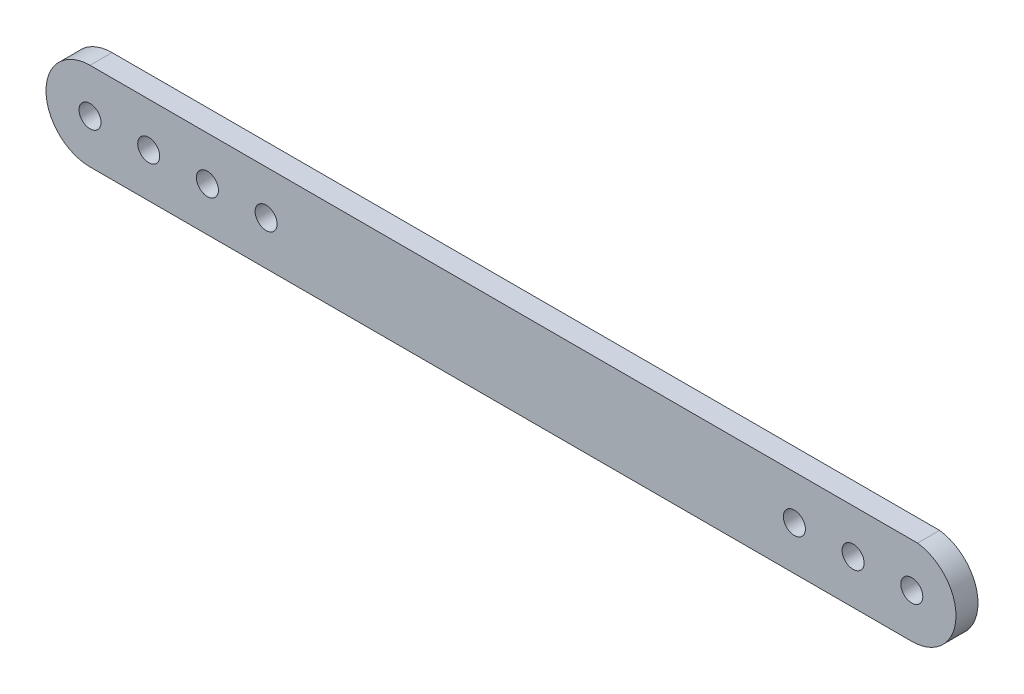
ISO-10303-21;
HEADER;
FILE_DESCRIPTION(('STEP AP214'),'2;1');
FILE_NAME('part.step','',(''),(''),'','','');
FILE_SCHEMA(('AUTOMOTIVE_DESIGN { 1 0 10303 214 1 1 1 1 }'));
ENDSEC;
DATA;
#1=APPLICATION_CONTEXT('core data for automotive mechanical design processes');
#2=APPLICATION_PROTOCOL_DEFINITION('international standard','automotive_design',2000,#1);
#3=PRODUCT_CONTEXT('',#1,'mechanical');
#4=PRODUCT('Part','Part','',(#3));
#5=PRODUCT_RELATED_PRODUCT_CATEGORY('part','',(#4));
#6=PRODUCT_DEFINITION_FORMATION('','',#4);
#7=PRODUCT_DEFINITION_CONTEXT('part definition',#1,'design');
#8=PRODUCT_DEFINITION('design','',#6,#7);
#9=PRODUCT_DEFINITION_SHAPE('','',#8);
#10=(LENGTH_UNIT() NAMED_UNIT(*) SI_UNIT(.MILLI.,.METRE.));
#11=(NAMED_UNIT(*) PLANE_ANGLE_UNIT() SI_UNIT($,.RADIAN.));
#12=(NAMED_UNIT(*) SI_UNIT($,.STERADIAN.) SOLID_ANGLE_UNIT());
#13=UNCERTAINTY_MEASURE_WITH_UNIT(LENGTH_MEASURE(1.E-05),#10,'distance_accuracy_value','');
#14=(GEOMETRIC_REPRESENTATION_CONTEXT(3) GLOBAL_UNCERTAINTY_ASSIGNED_CONTEXT((#13)) GLOBAL_UNIT_ASSIGNED_CONTEXT((#10,
#11,#12)) REPRESENTATION_CONTEXT('',''));
#15=CARTESIAN_POINT('',(0.,0.,0.));
#16=DIRECTION('',(0.,0.,1.));
#17=DIRECTION('',(1.,0.,0.));
#18=AXIS2_PLACEMENT_3D('',#15,#16,#17);
#19=CARTESIAN_POINT('',(0.,0.,4.7625));
#20=DIRECTION('',(0.,0.,1.));
#21=DIRECTION('',(1.,0.,0.));
#22=AXIS2_PLACEMENT_3D('',#19,#20,#21);
#23=PLANE('',#22);
#24=CARTESIAN_POINT('',(165.1,2.21750824338182E-07,4.7625));
#25=DIRECTION('',(0.,0.,1.));
#26=DIRECTION('',(1.,0.,0.));
#27=AXIS2_PLACEMENT_3D('',#24,#25,#26);
#28=CIRCLE('',#27,2.38125000000001);
#29=CARTESIAN_POINT('',(162.71875,2.21750824338182E-07,4.7625));
#30=VERTEX_POINT('',#29);
#31=EDGE_CURVE('E139',#30,#30,#28,.T.);
#32=ORIENTED_EDGE('',*,*,#31,.F.);
#33=EDGE_LOOP('',(#32));
#34=FACE_BOUND('',#33,.T.);
#35=CARTESIAN_POINT('',(38.1,0.,4.7625));
#36=DIRECTION('',(0.,0.,1.));
#37=DIRECTION('',(1.,0.,0.));
#38=AXIS2_PLACEMENT_3D('',#35,#36,#37);
#39=CIRCLE('',#38,2.38125);
#40=CARTESIAN_POINT('',(35.71875,0.,4.7625));
#41=VERTEX_POINT('',#40);
#42=EDGE_CURVE('E127',#41,#41,#39,.T.);
#43=ORIENTED_EDGE('',*,*,#42,.F.);
#44=EDGE_LOOP('',(#43));
#45=FACE_BOUND('',#44,.T.);
#46=CARTESIAN_POINT('',(12.7,0.,4.7625));
#47=DIRECTION('',(0.,0.,1.));
#48=DIRECTION('',(1.,0.,0.));
#49=AXIS2_PLACEMENT_3D('',#46,#47,#48);
#50=CIRCLE('',#49,2.38125);
#51=CARTESIAN_POINT('',(10.31875,0.,4.7625));
#52=VERTEX_POINT('',#51);
#53=EDGE_CURVE('E115',#52,#52,#50,.T.);
#54=ORIENTED_EDGE('',*,*,#53,.F.);
#55=EDGE_LOOP('',(#54));
#56=FACE_BOUND('',#55,.T.);
#57=CARTESIAN_POINT('',(0.,0.,4.7625));
#58=DIRECTION('',(0.,0.,1.));
#59=DIRECTION('',(1.,0.,0.));
#60=AXIS2_PLACEMENT_3D('',#57,#58,#59);
#61=CIRCLE('',#60,9.525);
#62=CARTESIAN_POINT('',(0.,9.525,4.7625));
#63=VERTEX_POINT('',#62);
#64=CARTESIAN_POINT('',(0.,-9.525,4.7625));
#65=VERTEX_POINT('',#64);
#66=EDGE_CURVE('E85',#63,#65,#61,.T.);
#67=ORIENTED_EDGE('',*,*,#66,.T.);
#68=DIRECTION('',(1.,0.,0.));
#69=VECTOR('',#68,1.);
#70=CARTESIAN_POINT('',(0.,-9.525,4.7625));
#71=LINE('',#70,#69);
#72=CARTESIAN_POINT('',(177.799932549432,-9.525,4.7625));
#73=VERTEX_POINT('',#72);
#74=EDGE_CURVE('E80',#65,#73,#71,.T.);
#75=ORIENTED_EDGE('',*,*,#74,.T.);
#76=CARTESIAN_POINT('',(177.799932549432,0.0413915238402598,4.7625));
#77=DIRECTION('',(0.,0.,1.));
#78=DIRECTION('',(1.,0.,0.));
#79=AXIS2_PLACEMENT_3D('',#76,#77,#78);
#80=CIRCLE('',#79,9.56639152384026);
#81=CARTESIAN_POINT('',(179.055725947373,9.525,4.7625));
#82=VERTEX_POINT('',#81);
#83=EDGE_CURVE('E83',#73,#82,#80,.T.);
#84=ORIENTED_EDGE('',*,*,#83,.T.);
#85=DIRECTION('',(-1.,0.,0.));
#86=VECTOR('',#85,1.);
#87=CARTESIAN_POINT('',(0.,9.525,4.7625));
#88=LINE('',#87,#86);
#89=EDGE_CURVE('E50',#82,#63,#88,.T.);
#90=ORIENTED_EDGE('',*,*,#89,.T.);
#91=EDGE_LOOP('',(#67,#75,#84,#90));
#92=FACE_BOUND('',#91,.T.);
#93=CARTESIAN_POINT('',(0.,0.,4.7625));
#94=DIRECTION('',(0.,0.,1.));
#95=DIRECTION('',(1.,0.,0.));
#96=AXIS2_PLACEMENT_3D('',#93,#94,#95);
#97=CIRCLE('',#96,2.38125);
#98=CARTESIAN_POINT('',(-2.38125,0.,4.7625));
#99=VERTEX_POINT('',#98);
#100=EDGE_CURVE('E100',#99,#99,#97,.T.);
#101=ORIENTED_EDGE('',*,*,#100,.F.);
#102=EDGE_LOOP('',(#101));
#103=FACE_BOUND('',#102,.T.);
#104=CARTESIAN_POINT('',(25.4,0.,4.7625));
#105=DIRECTION('',(0.,0.,1.));
#106=DIRECTION('',(1.,0.,0.));
#107=AXIS2_PLACEMENT_3D('',#104,#105,#106);
#108=CIRCLE('',#107,2.38125);
#109=CARTESIAN_POINT('',(23.01875,0.,4.7625));
#110=VERTEX_POINT('',#109);
#111=EDGE_CURVE('E121',#110,#110,#108,.T.);
#112=ORIENTED_EDGE('',*,*,#111,.F.);
#113=EDGE_LOOP('',(#112));
#114=FACE_BOUND('',#113,.T.);
#115=CARTESIAN_POINT('',(177.799932549432,0.0413915238402598,4.7625));
#116=DIRECTION('',(0.,0.,1.));
#117=DIRECTION('',(1.,0.,0.));
#118=AXIS2_PLACEMENT_3D('',#115,#116,#117);
#119=CIRCLE('',#118,2.38125000000001);
#120=CARTESIAN_POINT('',(175.418682549432,0.0413915238402598,4.7625));
#121=VERTEX_POINT('',#120);
#122=EDGE_CURVE('E133',#121,#121,#119,.T.);
#123=ORIENTED_EDGE('',*,*,#122,.F.);
#124=EDGE_LOOP('',(#123));
#125=FACE_BOUND('',#124,.T.);
#126=CARTESIAN_POINT('',(152.4,2.6927270091158E-08,4.7625));
#127=DIRECTION('',(0.,0.,1.));
#128=DIRECTION('',(1.,0.,0.));
#129=AXIS2_PLACEMENT_3D('',#126,#127,#128);
#130=CIRCLE('',#129,2.38125000000001);
#131=CARTESIAN_POINT('',(150.01875,2.6927270091158E-08,4.7625));
#132=VERTEX_POINT('',#131);
#133=EDGE_CURVE('E145',#132,#132,#130,.T.);
#134=ORIENTED_EDGE('',*,*,#133,.F.);
#135=EDGE_LOOP('',(#134));
#136=FACE_BOUND('',#135,.T.);
#137=ADVANCED_FACE('F33',(#34,#45,#56,#92,#103,#114,#125,#136),#23,.T.);
#138=CARTESIAN_POINT('',(0.,0.,0.));
#139=DIRECTION('',(0.,0.,1.));
#140=DIRECTION('',(1.,0.,0.));
#141=AXIS2_PLACEMENT_3D('',#138,#139,#140);
#142=PLANE('',#141);
#143=CARTESIAN_POINT('',(0.,0.,0.));
#144=DIRECTION('',(0.,0.,1.));
#145=DIRECTION('',(1.,0.,0.));
#146=AXIS2_PLACEMENT_3D('',#143,#144,#145);
#147=CIRCLE('',#146,9.525);
#148=CARTESIAN_POINT('',(0.,9.525,0.));
#149=VERTEX_POINT('',#148);
#150=CARTESIAN_POINT('',(0.,-9.525,0.));
#151=VERTEX_POINT('',#150);
#152=EDGE_CURVE('E97',#149,#151,#147,.T.);
#153=ORIENTED_EDGE('',*,*,#152,.F.);
#154=DIRECTION('',(-1.,0.,0.));
#155=VECTOR('',#154,1.);
#156=CARTESIAN_POINT('',(0.,9.525,0.));
#157=LINE('',#156,#155);
#158=CARTESIAN_POINT('',(179.055725947373,9.525,0.));
#159=VERTEX_POINT('',#158);
#160=EDGE_CURVE('E73',#159,#149,#157,.T.);
#161=ORIENTED_EDGE('',*,*,#160,.F.);
#162=CARTESIAN_POINT('',(177.799932549432,0.0413915238402598,0.));
#163=DIRECTION('',(0.,0.,1.));
#164=DIRECTION('',(1.,0.,0.));
#165=AXIS2_PLACEMENT_3D('',#162,#163,#164);
#166=CIRCLE('',#165,9.56639152384026);
#167=CARTESIAN_POINT('',(177.799932549432,-9.525,0.));
#168=VERTEX_POINT('',#167);
#169=EDGE_CURVE('E67',#168,#159,#166,.T.);
#170=ORIENTED_EDGE('',*,*,#169,.F.);
#171=DIRECTION('',(1.,0.,0.));
#172=VECTOR('',#171,1.);
#173=CARTESIAN_POINT('',(0.,-9.525,0.));
#174=LINE('',#173,#172);
#175=EDGE_CURVE('E89',#151,#168,#174,.T.);
#176=ORIENTED_EDGE('',*,*,#175,.F.);
#177=EDGE_LOOP('',(#153,#161,#170,#176));
#178=FACE_BOUND('',#177,.T.);
#179=CARTESIAN_POINT('',(0.,0.,0.));
#180=DIRECTION('',(0.,0.,1.));
#181=DIRECTION('',(1.,0.,0.));
#182=AXIS2_PLACEMENT_3D('',#179,#180,#181);
#183=CIRCLE('',#182,2.38125);
#184=CARTESIAN_POINT('',(-2.38125,0.,0.));
#185=VERTEX_POINT('',#184);
#186=EDGE_CURVE('E112',#185,#185,#183,.T.);
#187=ORIENTED_EDGE('',*,*,#186,.T.);
#188=EDGE_LOOP('',(#187));
#189=FACE_BOUND('',#188,.T.);
#190=CARTESIAN_POINT('',(12.7,0.,0.));
#191=DIRECTION('',(0.,0.,1.));
#192=DIRECTION('',(1.,0.,0.));
#193=AXIS2_PLACEMENT_3D('',#190,#191,#192);
#194=CIRCLE('',#193,2.38125);
#195=CARTESIAN_POINT('',(10.31875,0.,0.));
#196=VERTEX_POINT('',#195);
#197=EDGE_CURVE('E118',#196,#196,#194,.T.);
#198=ORIENTED_EDGE('',*,*,#197,.T.);
#199=EDGE_LOOP('',(#198));
#200=FACE_BOUND('',#199,.T.);
#201=CARTESIAN_POINT('',(25.4,0.,0.));
#202=DIRECTION('',(0.,0.,1.));
#203=DIRECTION('',(1.,0.,0.));
#204=AXIS2_PLACEMENT_3D('',#201,#202,#203);
#205=CIRCLE('',#204,2.38125);
#206=CARTESIAN_POINT('',(23.01875,0.,0.));
#207=VERTEX_POINT('',#206);
#208=EDGE_CURVE('E124',#207,#207,#205,.T.);
#209=ORIENTED_EDGE('',*,*,#208,.T.);
#210=EDGE_LOOP('',(#209));
#211=FACE_BOUND('',#210,.T.);
#212=CARTESIAN_POINT('',(38.1,0.,0.));
#213=DIRECTION('',(0.,0.,1.));
#214=DIRECTION('',(1.,0.,0.));
#215=AXIS2_PLACEMENT_3D('',#212,#213,#214);
#216=CIRCLE('',#215,2.38125);
#217=CARTESIAN_POINT('',(35.71875,0.,0.));
#218=VERTEX_POINT('',#217);
#219=EDGE_CURVE('E130',#218,#218,#216,.T.);
#220=ORIENTED_EDGE('',*,*,#219,.T.);
#221=EDGE_LOOP('',(#220));
#222=FACE_BOUND('',#221,.T.);
#223=CARTESIAN_POINT('',(177.799932549432,0.0413915238402598,0.));
#224=DIRECTION('',(0.,0.,1.));
#225=DIRECTION('',(1.,0.,0.));
#226=AXIS2_PLACEMENT_3D('',#223,#224,#225);
#227=CIRCLE('',#226,2.38125000000001);
#228=CARTESIAN_POINT('',(175.418682549432,0.0413915238402598,0.));
#229=VERTEX_POINT('',#228);
#230=EDGE_CURVE('E136',#229,#229,#227,.T.);
#231=ORIENTED_EDGE('',*,*,#230,.T.);
#232=EDGE_LOOP('',(#231));
#233=FACE_BOUND('',#232,.T.);
#234=CARTESIAN_POINT('',(165.1,2.21750824338182E-07,0.));
#235=DIRECTION('',(0.,0.,1.));
#236=DIRECTION('',(1.,0.,0.));
#237=AXIS2_PLACEMENT_3D('',#234,#235,#236);
#238=CIRCLE('',#237,2.38125000000001);
#239=CARTESIAN_POINT('',(162.71875,2.21750824338182E-07,0.));
#240=VERTEX_POINT('',#239);
#241=EDGE_CURVE('E142',#240,#240,#238,.T.);
#242=ORIENTED_EDGE('',*,*,#241,.T.);
#243=EDGE_LOOP('',(#242));
#244=FACE_BOUND('',#243,.T.);
#245=CARTESIAN_POINT('',(152.4,2.6927270091158E-08,0.));
#246=DIRECTION('',(0.,0.,1.));
#247=DIRECTION('',(1.,0.,0.));
#248=AXIS2_PLACEMENT_3D('',#245,#246,#247);
#249=CIRCLE('',#248,2.38125000000001);
#250=CARTESIAN_POINT('',(150.01875,2.6927270091158E-08,0.));
#251=VERTEX_POINT('',#250);
#252=EDGE_CURVE('E148',#251,#251,#249,.T.);
#253=ORIENTED_EDGE('',*,*,#252,.T.);
#254=EDGE_LOOP('',(#253));
#255=FACE_BOUND('',#254,.T.);
#256=ADVANCED_FACE('F108',(#178,#189,#200,#211,#222,#233,#244,#255),#142,.F.);
#257=CARTESIAN_POINT('',(0.,0.,4.7625));
#258=DIRECTION('',(0.,0.,-1.));
#259=DIRECTION('',(-1.,0.,0.));
#260=AXIS2_PLACEMENT_3D('',#257,#258,#259);
#261=CYLINDRICAL_SURFACE('',#260,9.525);
#262=ORIENTED_EDGE('',*,*,#152,.T.);
#263=DIRECTION('',(0.,0.,-1.));
#264=VECTOR('',#263,1.);
#265=CARTESIAN_POINT('',(0.,-9.525,4.7625));
#266=LINE('',#265,#264);
#267=EDGE_CURVE('E11',#65,#151,#266,.T.);
#268=ORIENTED_EDGE('',*,*,#267,.F.);
#269=ORIENTED_EDGE('',*,*,#66,.F.);
#270=DIRECTION('',(0.,0.,-1.));
#271=VECTOR('',#270,1.);
#272=CARTESIAN_POINT('',(0.,9.525,4.7625));
#273=LINE('',#272,#271);
#274=EDGE_CURVE('E93',#63,#149,#273,.T.);
#275=ORIENTED_EDGE('',*,*,#274,.T.);
#276=EDGE_LOOP('',(#262,#268,#269,#275));
#277=FACE_BOUND('',#276,.T.);
#278=ADVANCED_FACE('F35',(#277),#261,.T.);
#279=CARTESIAN_POINT('',(0.,-9.525,4.7625));
#280=DIRECTION('',(0.,1.,0.));
#281=DIRECTION('',(-1.,0.,0.));
#282=AXIS2_PLACEMENT_3D('',#279,#280,#281);
#283=PLANE('',#282);
#284=ORIENTED_EDGE('',*,*,#175,.T.);
#285=DIRECTION('',(0.,0.,-1.));
#286=VECTOR('',#285,1.);
#287=CARTESIAN_POINT('',(177.799932549432,-9.525,4.7625));
#288=LINE('',#287,#286);
#289=EDGE_CURVE('E42',#73,#168,#288,.T.);
#290=ORIENTED_EDGE('',*,*,#289,.F.);
#291=ORIENTED_EDGE('',*,*,#74,.F.);
#292=ORIENTED_EDGE('',*,*,#267,.T.);
#293=EDGE_LOOP('',(#284,#290,#291,#292));
#294=FACE_BOUND('',#293,.T.);
#295=ADVANCED_FACE('F88',(#294),#283,.F.);
#296=CARTESIAN_POINT('',(177.799932549432,0.0413915238402598,4.7625));
#297=DIRECTION('',(0.,0.,-1.));
#298=DIRECTION('',(-1.,0.,0.));
#299=AXIS2_PLACEMENT_3D('',#296,#297,#298);
#300=CYLINDRICAL_SURFACE('',#299,9.56639152384026);
#301=ORIENTED_EDGE('',*,*,#169,.T.);
#302=DIRECTION('',(0.,0.,-1.));
#303=VECTOR('',#302,1.);
#304=CARTESIAN_POINT('',(179.055725947373,9.525,4.7625));
#305=LINE('',#304,#303);
#306=EDGE_CURVE('E90',#82,#159,#305,.T.);
#307=ORIENTED_EDGE('',*,*,#306,.F.);
#308=ORIENTED_EDGE('',*,*,#83,.F.);
#309=ORIENTED_EDGE('',*,*,#289,.T.);
#310=EDGE_LOOP('',(#301,#307,#308,#309));
#311=FACE_BOUND('',#310,.T.);
#312=ADVANCED_FACE('F91',(#311),#300,.T.);
#313=CARTESIAN_POINT('',(0.,9.525,4.7625));
#314=DIRECTION('',(0.,-1.,0.));
#315=DIRECTION('',(0.,0.,-1.));
#316=AXIS2_PLACEMENT_3D('',#313,#314,#315);
#317=PLANE('',#316);
#318=ORIENTED_EDGE('',*,*,#160,.T.);
#319=ORIENTED_EDGE('',*,*,#274,.F.);
#320=ORIENTED_EDGE('',*,*,#89,.F.);
#321=ORIENTED_EDGE('',*,*,#306,.T.);
#322=EDGE_LOOP('',(#318,#319,#320,#321));
#323=FACE_BOUND('',#322,.T.);
#324=ADVANCED_FACE('F105',(#323),#317,.F.);
#325=CARTESIAN_POINT('',(0.,0.,4.7625));
#326=DIRECTION('',(0.,0.,-1.));
#327=DIRECTION('',(-1.,0.,0.));
#328=AXIS2_PLACEMENT_3D('',#325,#326,#327);
#329=CYLINDRICAL_SURFACE('',#328,2.38125);
#330=CARTESIAN_POINT('',(-2.38125,0.,4.7625));
#331=CARTESIAN_POINT('',(-2.38125,0.,4.712890625));
#332=CARTESIAN_POINT('',(-2.38125,0.,4.66328125));
#333=CARTESIAN_POINT('',(-2.38125,0.,4.5640625));
#334=CARTESIAN_POINT('',(-2.38125,0.,4.514453125));
#335=CARTESIAN_POINT('',(-2.38125,0.,4.415234375));
#336=CARTESIAN_POINT('',(-2.38125,0.,4.365625));
#337=CARTESIAN_POINT('',(-2.38125,0.,4.26640625));
#338=CARTESIAN_POINT('',(-2.38125,0.,4.216796875));
#339=CARTESIAN_POINT('',(-2.38125,0.,4.117578125));
#340=CARTESIAN_POINT('',(-2.38125,0.,4.06796875));
#341=CARTESIAN_POINT('',(-2.38125,0.,3.96875));
#342=CARTESIAN_POINT('',(-2.38125,0.,3.919140625));
#343=CARTESIAN_POINT('',(-2.38125,0.,3.819921875));
#344=CARTESIAN_POINT('',(-2.38125,0.,3.7703125));
#345=CARTESIAN_POINT('',(-2.38125,0.,3.67109375));
#346=CARTESIAN_POINT('',(-2.38125,0.,3.621484375));
#347=CARTESIAN_POINT('',(-2.38125,0.,3.522265625));
#348=CARTESIAN_POINT('',(-2.38125,0.,3.47265625));
#349=CARTESIAN_POINT('',(-2.38125,0.,3.3734375));
#350=CARTESIAN_POINT('',(-2.38125,0.,3.323828125));
#351=CARTESIAN_POINT('',(-2.38125,0.,3.224609375));
#352=CARTESIAN_POINT('',(-2.38125,0.,3.175));
#353=CARTESIAN_POINT('',(-2.38125,0.,3.07578125));
#354=CARTESIAN_POINT('',(-2.38125,0.,3.026171875));
#355=CARTESIAN_POINT('',(-2.38125,0.,2.926953125));
#356=CARTESIAN_POINT('',(-2.38125,0.,2.87734375));
#357=CARTESIAN_POINT('',(-2.38125,0.,2.778125));
#358=CARTESIAN_POINT('',(-2.38125,0.,2.728515625));
#359=CARTESIAN_POINT('',(-2.38125,0.,2.629296875));
#360=CARTESIAN_POINT('',(-2.38125,0.,2.5796875));
#361=CARTESIAN_POINT('',(-2.38125,0.,2.48046875));
#362=CARTESIAN_POINT('',(-2.38125,0.,2.430859375));
#363=CARTESIAN_POINT('',(-2.38125,0.,2.331640625));
#364=CARTESIAN_POINT('',(-2.38125,0.,2.28203125));
#365=CARTESIAN_POINT('',(-2.38125,0.,2.1828125));
#366=CARTESIAN_POINT('',(-2.38125,0.,2.133203125));
#367=CARTESIAN_POINT('',(-2.38125,0.,2.033984375));
#368=CARTESIAN_POINT('',(-2.38125,0.,1.984375));
#369=CARTESIAN_POINT('',(-2.38125,0.,1.88515625));
#370=CARTESIAN_POINT('',(-2.38125,0.,1.835546875));
#371=CARTESIAN_POINT('',(-2.38125,0.,1.736328125));
#372=CARTESIAN_POINT('',(-2.38125,0.,1.68671875));
#373=CARTESIAN_POINT('',(-2.38125,0.,1.5875));
#374=CARTESIAN_POINT('',(-2.38125,0.,1.537890625));
#375=CARTESIAN_POINT('',(-2.38125,0.,1.438671875));
#376=CARTESIAN_POINT('',(-2.38125,0.,1.3890625));
#377=CARTESIAN_POINT('',(-2.38125,0.,1.28984375));
#378=CARTESIAN_POINT('',(-2.38125,0.,1.240234375));
#379=CARTESIAN_POINT('',(-2.38125,0.,1.141015625));
#380=CARTESIAN_POINT('',(-2.38125,0.,1.09140625));
#381=CARTESIAN_POINT('',(-2.38125,0.,0.992187499999999));
#382=CARTESIAN_POINT('',(-2.38125,0.,0.942578124999999));
#383=CARTESIAN_POINT('',(-2.38125,0.,0.843359375));
#384=CARTESIAN_POINT('',(-2.38125,0.,0.79375));
#385=CARTESIAN_POINT('',(-2.38125,0.,0.69453125));
#386=CARTESIAN_POINT('',(-2.38125,0.,0.644921875));
#387=CARTESIAN_POINT('',(-2.38125,0.,0.545703125));
#388=CARTESIAN_POINT('',(-2.38125,0.,0.49609375));
#389=CARTESIAN_POINT('',(-2.38125,0.,0.396875));
#390=CARTESIAN_POINT('',(-2.38125,0.,0.347265625));
#391=CARTESIAN_POINT('',(-2.38125,0.,0.248046875));
#392=CARTESIAN_POINT('',(-2.38125,0.,0.1984375));
#393=CARTESIAN_POINT('',(-2.38125,0.,0.09921875));
#394=CARTESIAN_POINT('',(-2.38125,0.,0.049609375));
#395=CARTESIAN_POINT('',(-2.38125,0.,0.));
#396=B_SPLINE_CURVE_WITH_KNOTS('',3,(#330,#331,#332,#333,#334,#335,#336,#337,#338,#339,#340,
#341,#342,#343,#344,#345,#346,#347,#348,#349,#350,#351,#352,#353,#354,#355,#356,#357,#358,#359,
#360,#361,#362,#363,#364,#365,#366,#367,#368,#369,#370,#371,#372,#373,#374,#375,#376,#377,#378,
#379,#380,#381,#382,#383,#384,#385,#386,#387,#388,#389,#390,#391,#392,#393,#394,#395),
.UNSPECIFIED.,.F.,.F.,(4,2,2,2,2,2,2,2,2,2,2,2,2,2,2,2,2,2,2,2,2,2,2,2,2,2,2,2,2,2,2,2,4),(0.,
0.148828125,0.29765625,0.446484375,0.5953125,0.744140625,0.892968750000001,1.041796875,1.190625,
1.339453125,1.48828125,1.637109375,1.7859375,1.934765625,2.08359375,2.232421875,2.38125,
2.530078125,2.67890625,2.827734375,2.9765625,3.125390625,3.27421875,3.423046875,3.571875,
3.720703125,3.86953125,4.018359375,4.1671875,4.316015625,4.46484375,4.613671875,4.7625),.UNSPECIFIED.);
#397=EDGE_CURVE('BSEAM167',#99,#185,#396,.T.);
#398=ORIENTED_EDGE('',*,*,#100,.T.);
#399=ORIENTED_EDGE('',*,*,#186,.F.);
#400=ORIENTED_EDGE('',*,*,#397,.T.);
#401=ORIENTED_EDGE('',*,*,#397,.F.);
#402=EDGE_LOOP('',(#398,#400,#399,#401));
#403=FACE_BOUND('',#402,.T.);
#404=ADVANCED_FACE('F167',(#403),#329,.F.);
#405=CARTESIAN_POINT('',(12.7,0.,4.7625));
#406=DIRECTION('',(0.,0.,-1.));
#407=DIRECTION('',(-1.,0.,0.));
#408=AXIS2_PLACEMENT_3D('',#405,#406,#407);
#409=CYLINDRICAL_SURFACE('',#408,2.38125);
#410=CARTESIAN_POINT('',(10.31875,0.,4.7625));
#411=CARTESIAN_POINT('',(10.31875,0.,4.712890625));
#412=CARTESIAN_POINT('',(10.31875,0.,4.66328125));
#413=CARTESIAN_POINT('',(10.31875,0.,4.5640625));
#414=CARTESIAN_POINT('',(10.31875,0.,4.514453125));
#415=CARTESIAN_POINT('',(10.31875,0.,4.415234375));
#416=CARTESIAN_POINT('',(10.31875,0.,4.365625));
#417=CARTESIAN_POINT('',(10.31875,0.,4.26640625));
#418=CARTESIAN_POINT('',(10.31875,0.,4.216796875));
#419=CARTESIAN_POINT('',(10.31875,0.,4.117578125));
#420=CARTESIAN_POINT('',(10.31875,0.,4.06796875));
#421=CARTESIAN_POINT('',(10.31875,0.,3.96875));
#422=CARTESIAN_POINT('',(10.31875,0.,3.919140625));
#423=CARTESIAN_POINT('',(10.31875,0.,3.819921875));
#424=CARTESIAN_POINT('',(10.31875,0.,3.7703125));
#425=CARTESIAN_POINT('',(10.31875,0.,3.67109375));
#426=CARTESIAN_POINT('',(10.31875,0.,3.621484375));
#427=CARTESIAN_POINT('',(10.31875,0.,3.522265625));
#428=CARTESIAN_POINT('',(10.31875,0.,3.47265625));
#429=CARTESIAN_POINT('',(10.31875,0.,3.3734375));
#430=CARTESIAN_POINT('',(10.31875,0.,3.323828125));
#431=CARTESIAN_POINT('',(10.31875,0.,3.224609375));
#432=CARTESIAN_POINT('',(10.31875,0.,3.175));
#433=CARTESIAN_POINT('',(10.31875,0.,3.07578125));
#434=CARTESIAN_POINT('',(10.31875,0.,3.026171875));
#435=CARTESIAN_POINT('',(10.31875,0.,2.926953125));
#436=CARTESIAN_POINT('',(10.31875,0.,2.87734375));
#437=CARTESIAN_POINT('',(10.31875,0.,2.778125));
#438=CARTESIAN_POINT('',(10.31875,0.,2.728515625));
#439=CARTESIAN_POINT('',(10.31875,0.,2.629296875));
#440=CARTESIAN_POINT('',(10.31875,0.,2.5796875));
#441=CARTESIAN_POINT('',(10.31875,0.,2.48046875));
#442=CARTESIAN_POINT('',(10.31875,0.,2.430859375));
#443=CARTESIAN_POINT('',(10.31875,0.,2.331640625));
#444=CARTESIAN_POINT('',(10.31875,0.,2.28203125));
#445=CARTESIAN_POINT('',(10.31875,0.,2.1828125));
#446=CARTESIAN_POINT('',(10.31875,0.,2.133203125));
#447=CARTESIAN_POINT('',(10.31875,0.,2.033984375));
#448=CARTESIAN_POINT('',(10.31875,0.,1.984375));
#449=CARTESIAN_POINT('',(10.31875,0.,1.88515625));
#450=CARTESIAN_POINT('',(10.31875,0.,1.835546875));
#451=CARTESIAN_POINT('',(10.31875,0.,1.736328125));
#452=CARTESIAN_POINT('',(10.31875,0.,1.68671875));
#453=CARTESIAN_POINT('',(10.31875,0.,1.5875));
#454=CARTESIAN_POINT('',(10.31875,0.,1.537890625));
#455=CARTESIAN_POINT('',(10.31875,0.,1.438671875));
#456=CARTESIAN_POINT('',(10.31875,0.,1.3890625));
#457=CARTESIAN_POINT('',(10.31875,0.,1.28984375));
#458=CARTESIAN_POINT('',(10.31875,0.,1.240234375));
#459=CARTESIAN_POINT('',(10.31875,0.,1.141015625));
#460=CARTESIAN_POINT('',(10.31875,0.,1.09140625));
#461=CARTESIAN_POINT('',(10.31875,0.,0.992187499999999));
#462=CARTESIAN_POINT('',(10.31875,0.,0.942578124999999));
#463=CARTESIAN_POINT('',(10.31875,0.,0.843359375));
#464=CARTESIAN_POINT('',(10.31875,0.,0.79375));
#465=CARTESIAN_POINT('',(10.31875,0.,0.69453125));
#466=CARTESIAN_POINT('',(10.31875,0.,0.644921875));
#467=CARTESIAN_POINT('',(10.31875,0.,0.545703125));
#468=CARTESIAN_POINT('',(10.31875,0.,0.49609375));
#469=CARTESIAN_POINT('',(10.31875,0.,0.396875));
#470=CARTESIAN_POINT('',(10.31875,0.,0.347265625));
#471=CARTESIAN_POINT('',(10.31875,0.,0.248046875));
#472=CARTESIAN_POINT('',(10.31875,0.,0.1984375));
#473=CARTESIAN_POINT('',(10.31875,0.,0.09921875));
#474=CARTESIAN_POINT('',(10.31875,0.,0.049609375));
#475=CARTESIAN_POINT('',(10.31875,0.,0.));
#476=B_SPLINE_CURVE_WITH_KNOTS('',3,(#410,#411,#412,#413,#414,#415,#416,#417,#418,#419,#420,
#421,#422,#423,#424,#425,#426,#427,#428,#429,#430,#431,#432,#433,#434,#435,#436,#437,#438,#439,
#440,#441,#442,#443,#444,#445,#446,#447,#448,#449,#450,#451,#452,#453,#454,#455,#456,#457,#458,
#459,#460,#461,#462,#463,#464,#465,#466,#467,#468,#469,#470,#471,#472,#473,#474,#475),
.UNSPECIFIED.,.F.,.F.,(4,2,2,2,2,2,2,2,2,2,2,2,2,2,2,2,2,2,2,2,2,2,2,2,2,2,2,2,2,2,2,2,4),(0.,
0.148828125,0.29765625,0.446484375,0.5953125,0.744140625,0.892968750000001,1.041796875,1.190625,
1.339453125,1.48828125,1.637109375,1.7859375,1.934765625,2.08359375,2.232421875,2.38125,
2.530078125,2.67890625,2.827734375,2.9765625,3.125390625,3.27421875,3.423046875,3.571875,
3.720703125,3.86953125,4.018359375,4.1671875,4.316015625,4.46484375,4.613671875,4.7625),.UNSPECIFIED.);
#477=EDGE_CURVE('BSEAM213',#52,#196,#476,.T.);
#478=ORIENTED_EDGE('',*,*,#53,.T.);
#479=ORIENTED_EDGE('',*,*,#197,.F.);
#480=ORIENTED_EDGE('',*,*,#477,.T.);
#481=ORIENTED_EDGE('',*,*,#477,.F.);
#482=EDGE_LOOP('',(#478,#480,#479,#481));
#483=FACE_BOUND('',#482,.T.);
#484=ADVANCED_FACE('F213',(#483),#409,.F.);
#485=CARTESIAN_POINT('',(25.4,0.,4.7625));
#486=DIRECTION('',(0.,0.,-1.));
#487=DIRECTION('',(-1.,0.,0.));
#488=AXIS2_PLACEMENT_3D('',#485,#486,#487);
#489=CYLINDRICAL_SURFACE('',#488,2.38125);
#490=CARTESIAN_POINT('',(23.01875,0.,4.7625));
#491=CARTESIAN_POINT('',(23.01875,0.,4.712890625));
#492=CARTESIAN_POINT('',(23.01875,0.,4.66328125));
#493=CARTESIAN_POINT('',(23.01875,0.,4.5640625));
#494=CARTESIAN_POINT('',(23.01875,0.,4.514453125));
#495=CARTESIAN_POINT('',(23.01875,0.,4.415234375));
#496=CARTESIAN_POINT('',(23.01875,0.,4.365625));
#497=CARTESIAN_POINT('',(23.01875,0.,4.26640625));
#498=CARTESIAN_POINT('',(23.01875,0.,4.216796875));
#499=CARTESIAN_POINT('',(23.01875,0.,4.117578125));
#500=CARTESIAN_POINT('',(23.01875,0.,4.06796875));
#501=CARTESIAN_POINT('',(23.01875,0.,3.96875));
#502=CARTESIAN_POINT('',(23.01875,0.,3.919140625));
#503=CARTESIAN_POINT('',(23.01875,0.,3.819921875));
#504=CARTESIAN_POINT('',(23.01875,0.,3.7703125));
#505=CARTESIAN_POINT('',(23.01875,0.,3.67109375));
#506=CARTESIAN_POINT('',(23.01875,0.,3.621484375));
#507=CARTESIAN_POINT('',(23.01875,0.,3.522265625));
#508=CARTESIAN_POINT('',(23.01875,0.,3.47265625));
#509=CARTESIAN_POINT('',(23.01875,0.,3.3734375));
#510=CARTESIAN_POINT('',(23.01875,0.,3.323828125));
#511=CARTESIAN_POINT('',(23.01875,0.,3.224609375));
#512=CARTESIAN_POINT('',(23.01875,0.,3.175));
#513=CARTESIAN_POINT('',(23.01875,0.,3.07578125));
#514=CARTESIAN_POINT('',(23.01875,0.,3.026171875));
#515=CARTESIAN_POINT('',(23.01875,0.,2.926953125));
#516=CARTESIAN_POINT('',(23.01875,0.,2.87734375));
#517=CARTESIAN_POINT('',(23.01875,0.,2.778125));
#518=CARTESIAN_POINT('',(23.01875,0.,2.728515625));
#519=CARTESIAN_POINT('',(23.01875,0.,2.629296875));
#520=CARTESIAN_POINT('',(23.01875,0.,2.5796875));
#521=CARTESIAN_POINT('',(23.01875,0.,2.48046875));
#522=CARTESIAN_POINT('',(23.01875,0.,2.430859375));
#523=CARTESIAN_POINT('',(23.01875,0.,2.331640625));
#524=CARTESIAN_POINT('',(23.01875,0.,2.28203125));
#525=CARTESIAN_POINT('',(23.01875,0.,2.1828125));
#526=CARTESIAN_POINT('',(23.01875,0.,2.133203125));
#527=CARTESIAN_POINT('',(23.01875,0.,2.033984375));
#528=CARTESIAN_POINT('',(23.01875,0.,1.984375));
#529=CARTESIAN_POINT('',(23.01875,0.,1.88515625));
#530=CARTESIAN_POINT('',(23.01875,0.,1.835546875));
#531=CARTESIAN_POINT('',(23.01875,0.,1.736328125));
#532=CARTESIAN_POINT('',(23.01875,0.,1.68671875));
#533=CARTESIAN_POINT('',(23.01875,0.,1.5875));
#534=CARTESIAN_POINT('',(23.01875,0.,1.537890625));
#535=CARTESIAN_POINT('',(23.01875,0.,1.438671875));
#536=CARTESIAN_POINT('',(23.01875,0.,1.3890625));
#537=CARTESIAN_POINT('',(23.01875,0.,1.28984375));
#538=CARTESIAN_POINT('',(23.01875,0.,1.240234375));
#539=CARTESIAN_POINT('',(23.01875,0.,1.141015625));
#540=CARTESIAN_POINT('',(23.01875,0.,1.09140625));
#541=CARTESIAN_POINT('',(23.01875,0.,0.992187499999999));
#542=CARTESIAN_POINT('',(23.01875,0.,0.942578124999999));
#543=CARTESIAN_POINT('',(23.01875,0.,0.843359375));
#544=CARTESIAN_POINT('',(23.01875,0.,0.79375));
#545=CARTESIAN_POINT('',(23.01875,0.,0.69453125));
#546=CARTESIAN_POINT('',(23.01875,0.,0.644921875));
#547=CARTESIAN_POINT('',(23.01875,0.,0.545703125));
#548=CARTESIAN_POINT('',(23.01875,0.,0.49609375));
#549=CARTESIAN_POINT('',(23.01875,0.,0.396875));
#550=CARTESIAN_POINT('',(23.01875,0.,0.347265625));
#551=CARTESIAN_POINT('',(23.01875,0.,0.248046875));
#552=CARTESIAN_POINT('',(23.01875,0.,0.1984375));
#553=CARTESIAN_POINT('',(23.01875,0.,0.09921875));
#554=CARTESIAN_POINT('',(23.01875,0.,0.049609375));
#555=CARTESIAN_POINT('',(23.01875,0.,0.));
#556=B_SPLINE_CURVE_WITH_KNOTS('',3,(#490,#491,#492,#493,#494,#495,#496,#497,#498,#499,#500,
#501,#502,#503,#504,#505,#506,#507,#508,#509,#510,#511,#512,#513,#514,#515,#516,#517,#518,#519,
#520,#521,#522,#523,#524,#525,#526,#527,#528,#529,#530,#531,#532,#533,#534,#535,#536,#537,#538,
#539,#540,#541,#542,#543,#544,#545,#546,#547,#548,#549,#550,#551,#552,#553,#554,#555),
.UNSPECIFIED.,.F.,.F.,(4,2,2,2,2,2,2,2,2,2,2,2,2,2,2,2,2,2,2,2,2,2,2,2,2,2,2,2,2,2,2,2,4),(0.,
0.148828125,0.29765625,0.446484375,0.5953125,0.744140625,0.892968750000001,1.041796875,1.190625,
1.339453125,1.48828125,1.637109375,1.7859375,1.934765625,2.08359375,2.232421875,2.38125,
2.530078125,2.67890625,2.827734375,2.9765625,3.125390625,3.27421875,3.423046875,3.571875,
3.720703125,3.86953125,4.018359375,4.1671875,4.316015625,4.46484375,4.613671875,4.7625),.UNSPECIFIED.);
#557=EDGE_CURVE('BSEAM221',#110,#207,#556,.T.);
#558=ORIENTED_EDGE('',*,*,#111,.T.);
#559=ORIENTED_EDGE('',*,*,#208,.F.);
#560=ORIENTED_EDGE('',*,*,#557,.T.);
#561=ORIENTED_EDGE('',*,*,#557,.F.);
#562=EDGE_LOOP('',(#558,#560,#559,#561));
#563=FACE_BOUND('',#562,.T.);
#564=ADVANCED_FACE('F221',(#563),#489,.F.);
#565=CARTESIAN_POINT('',(38.1,0.,4.7625));
#566=DIRECTION('',(0.,0.,-1.));
#567=DIRECTION('',(-1.,0.,0.));
#568=AXIS2_PLACEMENT_3D('',#565,#566,#567);
#569=CYLINDRICAL_SURFACE('',#568,2.38125);
#570=CARTESIAN_POINT('',(35.71875,0.,4.7625));
#571=CARTESIAN_POINT('',(35.71875,0.,4.712890625));
#572=CARTESIAN_POINT('',(35.71875,0.,4.66328125));
#573=CARTESIAN_POINT('',(35.71875,0.,4.5640625));
#574=CARTESIAN_POINT('',(35.71875,0.,4.514453125));
#575=CARTESIAN_POINT('',(35.71875,0.,4.415234375));
#576=CARTESIAN_POINT('',(35.71875,0.,4.365625));
#577=CARTESIAN_POINT('',(35.71875,0.,4.26640625));
#578=CARTESIAN_POINT('',(35.71875,0.,4.216796875));
#579=CARTESIAN_POINT('',(35.71875,0.,4.117578125));
#580=CARTESIAN_POINT('',(35.71875,0.,4.06796875));
#581=CARTESIAN_POINT('',(35.71875,0.,3.96875));
#582=CARTESIAN_POINT('',(35.71875,0.,3.919140625));
#583=CARTESIAN_POINT('',(35.71875,0.,3.819921875));
#584=CARTESIAN_POINT('',(35.71875,0.,3.7703125));
#585=CARTESIAN_POINT('',(35.71875,0.,3.67109375));
#586=CARTESIAN_POINT('',(35.71875,0.,3.621484375));
#587=CARTESIAN_POINT('',(35.71875,0.,3.522265625));
#588=CARTESIAN_POINT('',(35.71875,0.,3.47265625));
#589=CARTESIAN_POINT('',(35.71875,0.,3.3734375));
#590=CARTESIAN_POINT('',(35.71875,0.,3.323828125));
#591=CARTESIAN_POINT('',(35.71875,0.,3.224609375));
#592=CARTESIAN_POINT('',(35.71875,0.,3.175));
#593=CARTESIAN_POINT('',(35.71875,0.,3.07578125));
#594=CARTESIAN_POINT('',(35.71875,0.,3.026171875));
#595=CARTESIAN_POINT('',(35.71875,0.,2.926953125));
#596=CARTESIAN_POINT('',(35.71875,0.,2.87734375));
#597=CARTESIAN_POINT('',(35.71875,0.,2.778125));
#598=CARTESIAN_POINT('',(35.71875,0.,2.728515625));
#599=CARTESIAN_POINT('',(35.71875,0.,2.629296875));
#600=CARTESIAN_POINT('',(35.71875,0.,2.5796875));
#601=CARTESIAN_POINT('',(35.71875,0.,2.48046875));
#602=CARTESIAN_POINT('',(35.71875,0.,2.430859375));
#603=CARTESIAN_POINT('',(35.71875,0.,2.331640625));
#604=CARTESIAN_POINT('',(35.71875,0.,2.28203125));
#605=CARTESIAN_POINT('',(35.71875,0.,2.1828125));
#606=CARTESIAN_POINT('',(35.71875,0.,2.133203125));
#607=CARTESIAN_POINT('',(35.71875,0.,2.033984375));
#608=CARTESIAN_POINT('',(35.71875,0.,1.984375));
#609=CARTESIAN_POINT('',(35.71875,0.,1.88515625));
#610=CARTESIAN_POINT('',(35.71875,0.,1.835546875));
#611=CARTESIAN_POINT('',(35.71875,0.,1.736328125));
#612=CARTESIAN_POINT('',(35.71875,0.,1.68671875));
#613=CARTESIAN_POINT('',(35.71875,0.,1.5875));
#614=CARTESIAN_POINT('',(35.71875,0.,1.537890625));
#615=CARTESIAN_POINT('',(35.71875,0.,1.438671875));
#616=CARTESIAN_POINT('',(35.71875,0.,1.3890625));
#617=CARTESIAN_POINT('',(35.71875,0.,1.28984375));
#618=CARTESIAN_POINT('',(35.71875,0.,1.240234375));
#619=CARTESIAN_POINT('',(35.71875,0.,1.141015625));
#620=CARTESIAN_POINT('',(35.71875,0.,1.09140625));
#621=CARTESIAN_POINT('',(35.71875,0.,0.992187499999999));
#622=CARTESIAN_POINT('',(35.71875,0.,0.942578124999999));
#623=CARTESIAN_POINT('',(35.71875,0.,0.843359375));
#624=CARTESIAN_POINT('',(35.71875,0.,0.79375));
#625=CARTESIAN_POINT('',(35.71875,0.,0.69453125));
#626=CARTESIAN_POINT('',(35.71875,0.,0.644921875));
#627=CARTESIAN_POINT('',(35.71875,0.,0.545703125));
#628=CARTESIAN_POINT('',(35.71875,0.,0.49609375));
#629=CARTESIAN_POINT('',(35.71875,0.,0.396875));
#630=CARTESIAN_POINT('',(35.71875,0.,0.347265625));
#631=CARTESIAN_POINT('',(35.71875,0.,0.248046875));
#632=CARTESIAN_POINT('',(35.71875,0.,0.1984375));
#633=CARTESIAN_POINT('',(35.71875,0.,0.09921875));
#634=CARTESIAN_POINT('',(35.71875,0.,0.049609375));
#635=CARTESIAN_POINT('',(35.71875,0.,0.));
#636=B_SPLINE_CURVE_WITH_KNOTS('',3,(#570,#571,#572,#573,#574,#575,#576,#577,#578,#579,#580,
#581,#582,#583,#584,#585,#586,#587,#588,#589,#590,#591,#592,#593,#594,#595,#596,#597,#598,#599,
#600,#601,#602,#603,#604,#605,#606,#607,#608,#609,#610,#611,#612,#613,#614,#615,#616,#617,#618,
#619,#620,#621,#622,#623,#624,#625,#626,#627,#628,#629,#630,#631,#632,#633,#634,#635),
.UNSPECIFIED.,.F.,.F.,(4,2,2,2,2,2,2,2,2,2,2,2,2,2,2,2,2,2,2,2,2,2,2,2,2,2,2,2,2,2,2,2,4),(0.,
0.148828125,0.29765625,0.446484375,0.5953125,0.744140625,0.892968750000001,1.041796875,1.190625,
1.339453125,1.48828125,1.637109375,1.7859375,1.934765625,2.08359375,2.232421875,2.38125,
2.530078125,2.67890625,2.827734375,2.9765625,3.125390625,3.27421875,3.423046875,3.571875,
3.720703125,3.86953125,4.018359375,4.1671875,4.316015625,4.46484375,4.613671875,4.7625),.UNSPECIFIED.);
#637=EDGE_CURVE('BSEAM229',#41,#218,#636,.T.);
#638=ORIENTED_EDGE('',*,*,#42,.T.);
#639=ORIENTED_EDGE('',*,*,#219,.F.);
#640=ORIENTED_EDGE('',*,*,#637,.T.);
#641=ORIENTED_EDGE('',*,*,#637,.F.);
#642=EDGE_LOOP('',(#638,#640,#639,#641));
#643=FACE_BOUND('',#642,.T.);
#644=ADVANCED_FACE('F229',(#643),#569,.F.);
#645=CARTESIAN_POINT('',(177.799932549432,0.0413915238402598,4.7625));
#646=DIRECTION('',(0.,0.,-1.));
#647=DIRECTION('',(-1.,0.,0.));
#648=AXIS2_PLACEMENT_3D('',#645,#646,#647);
#649=CYLINDRICAL_SURFACE('',#648,2.38125000000001);
#650=CARTESIAN_POINT('',(175.418682549432,0.0413915238402598,4.7625));
#651=CARTESIAN_POINT('',(175.418682549432,0.0413915238402598,4.712890625));
#652=CARTESIAN_POINT('',(175.418682549432,0.0413915238402598,4.66328125));
#653=CARTESIAN_POINT('',(175.418682549432,0.0413915238402598,4.5640625));
#654=CARTESIAN_POINT('',(175.418682549432,0.0413915238402598,4.514453125));
#655=CARTESIAN_POINT('',(175.418682549432,0.0413915238402598,4.415234375));
#656=CARTESIAN_POINT('',(175.418682549432,0.0413915238402598,4.365625));
#657=CARTESIAN_POINT('',(175.418682549432,0.0413915238402598,4.26640625));
#658=CARTESIAN_POINT('',(175.418682549432,0.0413915238402598,4.216796875));
#659=CARTESIAN_POINT('',(175.418682549432,0.0413915238402598,4.117578125));
#660=CARTESIAN_POINT('',(175.418682549432,0.0413915238402598,4.06796875));
#661=CARTESIAN_POINT('',(175.418682549432,0.0413915238402598,3.96875));
#662=CARTESIAN_POINT('',(175.418682549432,0.0413915238402598,3.919140625));
#663=CARTESIAN_POINT('',(175.418682549432,0.0413915238402598,3.819921875));
#664=CARTESIAN_POINT('',(175.418682549432,0.0413915238402598,3.7703125));
#665=CARTESIAN_POINT('',(175.418682549432,0.0413915238402598,3.67109375));
#666=CARTESIAN_POINT('',(175.418682549432,0.0413915238402598,3.621484375));
#667=CARTESIAN_POINT('',(175.418682549432,0.0413915238402598,3.522265625));
#668=CARTESIAN_POINT('',(175.418682549432,0.0413915238402598,3.47265625));
#669=CARTESIAN_POINT('',(175.418682549432,0.0413915238402598,3.3734375));
#670=CARTESIAN_POINT('',(175.418682549432,0.0413915238402598,3.323828125));
#671=CARTESIAN_POINT('',(175.418682549432,0.0413915238402598,3.224609375));
#672=CARTESIAN_POINT('',(175.418682549432,0.0413915238402598,3.175));
#673=CARTESIAN_POINT('',(175.418682549432,0.0413915238402598,3.07578125));
#674=CARTESIAN_POINT('',(175.418682549432,0.0413915238402598,3.026171875));
#675=CARTESIAN_POINT('',(175.418682549432,0.0413915238402598,2.926953125));
#676=CARTESIAN_POINT('',(175.418682549432,0.0413915238402598,2.87734375));
#677=CARTESIAN_POINT('',(175.418682549432,0.0413915238402598,2.778125));
#678=CARTESIAN_POINT('',(175.418682549432,0.0413915238402598,2.728515625));
#679=CARTESIAN_POINT('',(175.418682549432,0.0413915238402598,2.629296875));
#680=CARTESIAN_POINT('',(175.418682549432,0.0413915238402598,2.5796875));
#681=CARTESIAN_POINT('',(175.418682549432,0.0413915238402598,2.48046875));
#682=CARTESIAN_POINT('',(175.418682549432,0.0413915238402598,2.430859375));
#683=CARTESIAN_POINT('',(175.418682549432,0.0413915238402598,2.331640625));
#684=CARTESIAN_POINT('',(175.418682549432,0.0413915238402598,2.28203125));
#685=CARTESIAN_POINT('',(175.418682549432,0.0413915238402598,2.1828125));
#686=CARTESIAN_POINT('',(175.418682549432,0.0413915238402598,2.133203125));
#687=CARTESIAN_POINT('',(175.418682549432,0.0413915238402598,2.033984375));
#688=CARTESIAN_POINT('',(175.418682549432,0.0413915238402598,1.984375));
#689=CARTESIAN_POINT('',(175.418682549432,0.0413915238402598,1.88515625));
#690=CARTESIAN_POINT('',(175.418682549432,0.0413915238402598,1.835546875));
#691=CARTESIAN_POINT('',(175.418682549432,0.0413915238402598,1.736328125));
#692=CARTESIAN_POINT('',(175.418682549432,0.0413915238402598,1.68671875));
#693=CARTESIAN_POINT('',(175.418682549432,0.0413915238402598,1.5875));
#694=CARTESIAN_POINT('',(175.418682549432,0.0413915238402598,1.537890625));
#695=CARTESIAN_POINT('',(175.418682549432,0.0413915238402598,1.438671875));
#696=CARTESIAN_POINT('',(175.418682549432,0.0413915238402598,1.3890625));
#697=CARTESIAN_POINT('',(175.418682549432,0.0413915238402598,1.28984375));
#698=CARTESIAN_POINT('',(175.418682549432,0.0413915238402598,1.240234375));
#699=CARTESIAN_POINT('',(175.418682549432,0.0413915238402598,1.141015625));
#700=CARTESIAN_POINT('',(175.418682549432,0.0413915238402598,1.09140625));
#701=CARTESIAN_POINT('',(175.418682549432,0.0413915238402598,0.992187499999999));
#702=CARTESIAN_POINT('',(175.418682549432,0.0413915238402598,0.942578124999999));
#703=CARTESIAN_POINT('',(175.418682549432,0.0413915238402598,0.843359375));
#704=CARTESIAN_POINT('',(175.418682549432,0.0413915238402598,0.79375));
#705=CARTESIAN_POINT('',(175.418682549432,0.0413915238402598,0.69453125));
#706=CARTESIAN_POINT('',(175.418682549432,0.0413915238402598,0.644921875));
#707=CARTESIAN_POINT('',(175.418682549432,0.0413915238402598,0.545703125));
#708=CARTESIAN_POINT('',(175.418682549432,0.0413915238402598,0.49609375));
#709=CARTESIAN_POINT('',(175.418682549432,0.0413915238402598,0.396875));
#710=CARTESIAN_POINT('',(175.418682549432,0.0413915238402598,0.347265625));
#711=CARTESIAN_POINT('',(175.418682549432,0.0413915238402598,0.248046875));
#712=CARTESIAN_POINT('',(175.418682549432,0.0413915238402598,0.1984375));
#713=CARTESIAN_POINT('',(175.418682549432,0.0413915238402598,0.09921875));
#714=CARTESIAN_POINT('',(175.418682549432,0.0413915238402598,0.049609375));
#715=CARTESIAN_POINT('',(175.418682549432,0.0413915238402598,0.));
#716=B_SPLINE_CURVE_WITH_KNOTS('',3,(#650,#651,#652,#653,#654,#655,#656,#657,#658,#659,#660,
#661,#662,#663,#664,#665,#666,#667,#668,#669,#670,#671,#672,#673,#674,#675,#676,#677,#678,#679,
#680,#681,#682,#683,#684,#685,#686,#687,#688,#689,#690,#691,#692,#693,#694,#695,#696,#697,#698,
#699,#700,#701,#702,#703,#704,#705,#706,#707,#708,#709,#710,#711,#712,#713,#714,#715),
.UNSPECIFIED.,.F.,.F.,(4,2,2,2,2,2,2,2,2,2,2,2,2,2,2,2,2,2,2,2,2,2,2,2,2,2,2,2,2,2,2,2,4),(0.,
0.148828125,0.29765625,0.446484375,0.5953125,0.744140625,0.892968750000001,1.041796875,1.190625,
1.339453125,1.48828125,1.637109375,1.7859375,1.934765625,2.08359375,2.232421875,2.38125,
2.530078125,2.67890625,2.827734375,2.9765625,3.125390625,3.27421875,3.423046875,3.571875,
3.720703125,3.86953125,4.018359375,4.1671875,4.316015625,4.46484375,4.613671875,4.7625),.UNSPECIFIED.);
#717=EDGE_CURVE('BSEAM238',#121,#229,#716,.T.);
#718=ORIENTED_EDGE('',*,*,#122,.T.);
#719=ORIENTED_EDGE('',*,*,#230,.F.);
#720=ORIENTED_EDGE('',*,*,#717,.T.);
#721=ORIENTED_EDGE('',*,*,#717,.F.);
#722=EDGE_LOOP('',(#718,#720,#719,#721));
#723=FACE_BOUND('',#722,.T.);
#724=ADVANCED_FACE('F238',(#723),#649,.F.);
#725=CARTESIAN_POINT('',(165.1,2.21750824338182E-07,4.7625));
#726=DIRECTION('',(0.,0.,-1.));
#727=DIRECTION('',(-1.,0.,0.));
#728=AXIS2_PLACEMENT_3D('',#725,#726,#727);
#729=CYLINDRICAL_SURFACE('',#728,2.38125000000001);
#730=CARTESIAN_POINT('',(162.71875,2.21750824338182E-07,4.7625));
#731=CARTESIAN_POINT('',(162.71875,2.21750824338182E-07,4.712890625));
#732=CARTESIAN_POINT('',(162.71875,2.21750824338182E-07,4.66328125));
#733=CARTESIAN_POINT('',(162.71875,2.21750824338182E-07,4.5640625));
#734=CARTESIAN_POINT('',(162.71875,2.21750824338182E-07,4.514453125));
#735=CARTESIAN_POINT('',(162.71875,2.21750824338182E-07,4.415234375));
#736=CARTESIAN_POINT('',(162.71875,2.21750824338182E-07,4.365625));
#737=CARTESIAN_POINT('',(162.71875,2.21750824338182E-07,4.26640625));
#738=CARTESIAN_POINT('',(162.71875,2.21750824338182E-07,4.216796875));
#739=CARTESIAN_POINT('',(162.71875,2.21750824338182E-07,4.117578125));
#740=CARTESIAN_POINT('',(162.71875,2.21750824338182E-07,4.06796875));
#741=CARTESIAN_POINT('',(162.71875,2.21750824338182E-07,3.96875));
#742=CARTESIAN_POINT('',(162.71875,2.21750824338182E-07,3.919140625));
#743=CARTESIAN_POINT('',(162.71875,2.21750824338182E-07,3.819921875));
#744=CARTESIAN_POINT('',(162.71875,2.21750824338182E-07,3.7703125));
#745=CARTESIAN_POINT('',(162.71875,2.21750824338182E-07,3.67109375));
#746=CARTESIAN_POINT('',(162.71875,2.21750824338182E-07,3.621484375));
#747=CARTESIAN_POINT('',(162.71875,2.21750824338182E-07,3.522265625));
#748=CARTESIAN_POINT('',(162.71875,2.21750824338182E-07,3.47265625));
#749=CARTESIAN_POINT('',(162.71875,2.21750824338182E-07,3.3734375));
#750=CARTESIAN_POINT('',(162.71875,2.21750824338182E-07,3.323828125));
#751=CARTESIAN_POINT('',(162.71875,2.21750824338182E-07,3.224609375));
#752=CARTESIAN_POINT('',(162.71875,2.21750824338182E-07,3.175));
#753=CARTESIAN_POINT('',(162.71875,2.21750824338182E-07,3.07578125));
#754=CARTESIAN_POINT('',(162.71875,2.21750824338182E-07,3.026171875));
#755=CARTESIAN_POINT('',(162.71875,2.21750824338182E-07,2.926953125));
#756=CARTESIAN_POINT('',(162.71875,2.21750824338182E-07,2.87734375));
#757=CARTESIAN_POINT('',(162.71875,2.21750824338182E-07,2.778125));
#758=CARTESIAN_POINT('',(162.71875,2.21750824338182E-07,2.728515625));
#759=CARTESIAN_POINT('',(162.71875,2.21750824338182E-07,2.629296875));
#760=CARTESIAN_POINT('',(162.71875,2.21750824338182E-07,2.5796875));
#761=CARTESIAN_POINT('',(162.71875,2.21750824338182E-07,2.48046875));
#762=CARTESIAN_POINT('',(162.71875,2.21750824338182E-07,2.430859375));
#763=CARTESIAN_POINT('',(162.71875,2.21750824338182E-07,2.331640625));
#764=CARTESIAN_POINT('',(162.71875,2.21750824338182E-07,2.28203125));
#765=CARTESIAN_POINT('',(162.71875,2.21750824338182E-07,2.1828125));
#766=CARTESIAN_POINT('',(162.71875,2.21750824338182E-07,2.133203125));
#767=CARTESIAN_POINT('',(162.71875,2.21750824338182E-07,2.033984375));
#768=CARTESIAN_POINT('',(162.71875,2.21750824338182E-07,1.984375));
#769=CARTESIAN_POINT('',(162.71875,2.21750824338182E-07,1.88515625));
#770=CARTESIAN_POINT('',(162.71875,2.21750824338182E-07,1.835546875));
#771=CARTESIAN_POINT('',(162.71875,2.21750824338182E-07,1.736328125));
#772=CARTESIAN_POINT('',(162.71875,2.21750824338182E-07,1.68671875));
#773=CARTESIAN_POINT('',(162.71875,2.21750824338182E-07,1.5875));
#774=CARTESIAN_POINT('',(162.71875,2.21750824338182E-07,1.537890625));
#775=CARTESIAN_POINT('',(162.71875,2.21750824338182E-07,1.438671875));
#776=CARTESIAN_POINT('',(162.71875,2.21750824338182E-07,1.3890625));
#777=CARTESIAN_POINT('',(162.71875,2.21750824338182E-07,1.28984375));
#778=CARTESIAN_POINT('',(162.71875,2.21750824338182E-07,1.240234375));
#779=CARTESIAN_POINT('',(162.71875,2.21750824338182E-07,1.141015625));
#780=CARTESIAN_POINT('',(162.71875,2.21750824338182E-07,1.09140625));
#781=CARTESIAN_POINT('',(162.71875,2.21750824338182E-07,0.992187499999999));
#782=CARTESIAN_POINT('',(162.71875,2.21750824338182E-07,0.942578124999999));
#783=CARTESIAN_POINT('',(162.71875,2.21750824338182E-07,0.843359375));
#784=CARTESIAN_POINT('',(162.71875,2.21750824338182E-07,0.79375));
#785=CARTESIAN_POINT('',(162.71875,2.21750824338182E-07,0.69453125));
#786=CARTESIAN_POINT('',(162.71875,2.21750824338182E-07,0.644921875));
#787=CARTESIAN_POINT('',(162.71875,2.21750824338182E-07,0.545703125));
#788=CARTESIAN_POINT('',(162.71875,2.21750824338182E-07,0.49609375));
#789=CARTESIAN_POINT('',(162.71875,2.21750824338182E-07,0.396875));
#790=CARTESIAN_POINT('',(162.71875,2.21750824338182E-07,0.347265625));
#791=CARTESIAN_POINT('',(162.71875,2.21750824338182E-07,0.248046875));
#792=CARTESIAN_POINT('',(162.71875,2.21750824338182E-07,0.1984375));
#793=CARTESIAN_POINT('',(162.71875,2.21750824338182E-07,0.09921875));
#794=CARTESIAN_POINT('',(162.71875,2.21750824338182E-07,0.049609375));
#795=CARTESIAN_POINT('',(162.71875,2.21750824338182E-07,0.));
#796=B_SPLINE_CURVE_WITH_KNOTS('',3,(#730,#731,#732,#733,#734,#735,#736,#737,#738,#739,#740,
#741,#742,#743,#744,#745,#746,#747,#748,#749,#750,#751,#752,#753,#754,#755,#756,#757,#758,#759,
#760,#761,#762,#763,#764,#765,#766,#767,#768,#769,#770,#771,#772,#773,#774,#775,#776,#777,#778,
#779,#780,#781,#782,#783,#784,#785,#786,#787,#788,#789,#790,#791,#792,#793,#794,#795),
.UNSPECIFIED.,.F.,.F.,(4,2,2,2,2,2,2,2,2,2,2,2,2,2,2,2,2,2,2,2,2,2,2,2,2,2,2,2,2,2,2,2,4),(0.,
0.148828125,0.29765625,0.446484375,0.5953125,0.744140625,0.892968750000001,1.041796875,1.190625,
1.339453125,1.48828125,1.637109375,1.7859375,1.934765625,2.08359375,2.232421875,2.38125,
2.530078125,2.67890625,2.827734375,2.9765625,3.125390625,3.27421875,3.423046875,3.571875,
3.720703125,3.86953125,4.018359375,4.1671875,4.316015625,4.46484375,4.613671875,4.7625),.UNSPECIFIED.);
#797=EDGE_CURVE('BSEAM247',#30,#240,#796,.T.);
#798=ORIENTED_EDGE('',*,*,#31,.T.);
#799=ORIENTED_EDGE('',*,*,#241,.F.);
#800=ORIENTED_EDGE('',*,*,#797,.T.);
#801=ORIENTED_EDGE('',*,*,#797,.F.);
#802=EDGE_LOOP('',(#798,#800,#799,#801));
#803=FACE_BOUND('',#802,.T.);
#804=ADVANCED_FACE('F247',(#803),#729,.F.);
#805=CARTESIAN_POINT('',(152.4,2.6927270091158E-08,4.7625));
#806=DIRECTION('',(0.,0.,-1.));
#807=DIRECTION('',(-1.,0.,0.));
#808=AXIS2_PLACEMENT_3D('',#805,#806,#807);
#809=CYLINDRICAL_SURFACE('',#808,2.38125000000001);
#810=CARTESIAN_POINT('',(150.01875,2.6927270091158E-08,4.7625));
#811=CARTESIAN_POINT('',(150.01875,2.6927270091158E-08,4.712890625));
#812=CARTESIAN_POINT('',(150.01875,2.6927270091158E-08,4.66328125));
#813=CARTESIAN_POINT('',(150.01875,2.6927270091158E-08,4.5640625));
#814=CARTESIAN_POINT('',(150.01875,2.6927270091158E-08,4.514453125));
#815=CARTESIAN_POINT('',(150.01875,2.6927270091158E-08,4.415234375));
#816=CARTESIAN_POINT('',(150.01875,2.6927270091158E-08,4.365625));
#817=CARTESIAN_POINT('',(150.01875,2.6927270091158E-08,4.26640625));
#818=CARTESIAN_POINT('',(150.01875,2.6927270091158E-08,4.216796875));
#819=CARTESIAN_POINT('',(150.01875,2.6927270091158E-08,4.117578125));
#820=CARTESIAN_POINT('',(150.01875,2.6927270091158E-08,4.06796875));
#821=CARTESIAN_POINT('',(150.01875,2.6927270091158E-08,3.96875));
#822=CARTESIAN_POINT('',(150.01875,2.6927270091158E-08,3.919140625));
#823=CARTESIAN_POINT('',(150.01875,2.6927270091158E-08,3.819921875));
#824=CARTESIAN_POINT('',(150.01875,2.6927270091158E-08,3.7703125));
#825=CARTESIAN_POINT('',(150.01875,2.6927270091158E-08,3.67109375));
#826=CARTESIAN_POINT('',(150.01875,2.6927270091158E-08,3.621484375));
#827=CARTESIAN_POINT('',(150.01875,2.6927270091158E-08,3.522265625));
#828=CARTESIAN_POINT('',(150.01875,2.6927270091158E-08,3.47265625));
#829=CARTESIAN_POINT('',(150.01875,2.6927270091158E-08,3.3734375));
#830=CARTESIAN_POINT('',(150.01875,2.6927270091158E-08,3.323828125));
#831=CARTESIAN_POINT('',(150.01875,2.6927270091158E-08,3.224609375));
#832=CARTESIAN_POINT('',(150.01875,2.6927270091158E-08,3.175));
#833=CARTESIAN_POINT('',(150.01875,2.6927270091158E-08,3.07578125));
#834=CARTESIAN_POINT('',(150.01875,2.6927270091158E-08,3.026171875));
#835=CARTESIAN_POINT('',(150.01875,2.6927270091158E-08,2.926953125));
#836=CARTESIAN_POINT('',(150.01875,2.6927270091158E-08,2.87734375));
#837=CARTESIAN_POINT('',(150.01875,2.6927270091158E-08,2.778125));
#838=CARTESIAN_POINT('',(150.01875,2.6927270091158E-08,2.728515625));
#839=CARTESIAN_POINT('',(150.01875,2.6927270091158E-08,2.629296875));
#840=CARTESIAN_POINT('',(150.01875,2.6927270091158E-08,2.5796875));
#841=CARTESIAN_POINT('',(150.01875,2.6927270091158E-08,2.48046875));
#842=CARTESIAN_POINT('',(150.01875,2.6927270091158E-08,2.430859375));
#843=CARTESIAN_POINT('',(150.01875,2.6927270091158E-08,2.331640625));
#844=CARTESIAN_POINT('',(150.01875,2.6927270091158E-08,2.28203125));
#845=CARTESIAN_POINT('',(150.01875,2.6927270091158E-08,2.1828125));
#846=CARTESIAN_POINT('',(150.01875,2.6927270091158E-08,2.133203125));
#847=CARTESIAN_POINT('',(150.01875,2.6927270091158E-08,2.033984375));
#848=CARTESIAN_POINT('',(150.01875,2.6927270091158E-08,1.984375));
#849=CARTESIAN_POINT('',(150.01875,2.6927270091158E-08,1.88515625));
#850=CARTESIAN_POINT('',(150.01875,2.6927270091158E-08,1.835546875));
#851=CARTESIAN_POINT('',(150.01875,2.6927270091158E-08,1.736328125));
#852=CARTESIAN_POINT('',(150.01875,2.6927270091158E-08,1.68671875));
#853=CARTESIAN_POINT('',(150.01875,2.6927270091158E-08,1.5875));
#854=CARTESIAN_POINT('',(150.01875,2.6927270091158E-08,1.537890625));
#855=CARTESIAN_POINT('',(150.01875,2.6927270091158E-08,1.438671875));
#856=CARTESIAN_POINT('',(150.01875,2.6927270091158E-08,1.3890625));
#857=CARTESIAN_POINT('',(150.01875,2.6927270091158E-08,1.28984375));
#858=CARTESIAN_POINT('',(150.01875,2.6927270091158E-08,1.240234375));
#859=CARTESIAN_POINT('',(150.01875,2.6927270091158E-08,1.141015625));
#860=CARTESIAN_POINT('',(150.01875,2.6927270091158E-08,1.09140625));
#861=CARTESIAN_POINT('',(150.01875,2.6927270091158E-08,0.992187499999999));
#862=CARTESIAN_POINT('',(150.01875,2.6927270091158E-08,0.942578124999999));
#863=CARTESIAN_POINT('',(150.01875,2.6927270091158E-08,0.843359375));
#864=CARTESIAN_POINT('',(150.01875,2.6927270091158E-08,0.79375));
#865=CARTESIAN_POINT('',(150.01875,2.6927270091158E-08,0.69453125));
#866=CARTESIAN_POINT('',(150.01875,2.6927270091158E-08,0.644921875));
#867=CARTESIAN_POINT('',(150.01875,2.6927270091158E-08,0.545703125));
#868=CARTESIAN_POINT('',(150.01875,2.6927270091158E-08,0.49609375));
#869=CARTESIAN_POINT('',(150.01875,2.6927270091158E-08,0.396875));
#870=CARTESIAN_POINT('',(150.01875,2.6927270091158E-08,0.347265625));
#871=CARTESIAN_POINT('',(150.01875,2.6927270091158E-08,0.248046875));
#872=CARTESIAN_POINT('',(150.01875,2.6927270091158E-08,0.1984375));
#873=CARTESIAN_POINT('',(150.01875,2.6927270091158E-08,0.09921875));
#874=CARTESIAN_POINT('',(150.01875,2.6927270091158E-08,0.049609375));
#875=CARTESIAN_POINT('',(150.01875,2.6927270091158E-08,0.));
#876=B_SPLINE_CURVE_WITH_KNOTS('',3,(#810,#811,#812,#813,#814,#815,#816,#817,#818,#819,#820,
#821,#822,#823,#824,#825,#826,#827,#828,#829,#830,#831,#832,#833,#834,#835,#836,#837,#838,#839,
#840,#841,#842,#843,#844,#845,#846,#847,#848,#849,#850,#851,#852,#853,#854,#855,#856,#857,#858,
#859,#860,#861,#862,#863,#864,#865,#866,#867,#868,#869,#870,#871,#872,#873,#874,#875),
.UNSPECIFIED.,.F.,.F.,(4,2,2,2,2,2,2,2,2,2,2,2,2,2,2,2,2,2,2,2,2,2,2,2,2,2,2,2,2,2,2,2,4),(0.,
0.148828125,0.29765625,0.446484375,0.5953125,0.744140625,0.892968750000001,1.041796875,1.190625,
1.339453125,1.48828125,1.637109375,1.7859375,1.934765625,2.08359375,2.232421875,2.38125,
2.530078125,2.67890625,2.827734375,2.9765625,3.125390625,3.27421875,3.423046875,3.571875,
3.720703125,3.86953125,4.018359375,4.1671875,4.316015625,4.46484375,4.613671875,4.7625),.UNSPECIFIED.);
#877=EDGE_CURVE('BSEAM154',#132,#251,#876,.T.);
#878=ORIENTED_EDGE('',*,*,#133,.T.);
#879=ORIENTED_EDGE('',*,*,#252,.F.);
#880=ORIENTED_EDGE('',*,*,#877,.T.);
#881=ORIENTED_EDGE('',*,*,#877,.F.);
#882=EDGE_LOOP('',(#878,#880,#879,#881));
#883=FACE_BOUND('',#882,.T.);
#884=ADVANCED_FACE('F154',(#883),#809,.F.);
#885=CLOSED_SHELL('',(#137,#256,#278,#295,#312,#324,#404,#484,#564,#644,#724,#804,#884));
#886=MANIFOLD_SOLID_BREP('B2',#885);
#887=ADVANCED_BREP_SHAPE_REPRESENTATION('',(#18,#886),#14);
#888=SHAPE_DEFINITION_REPRESENTATION(#9,#887);
ENDSEC;
END-ISO-10303-21;
